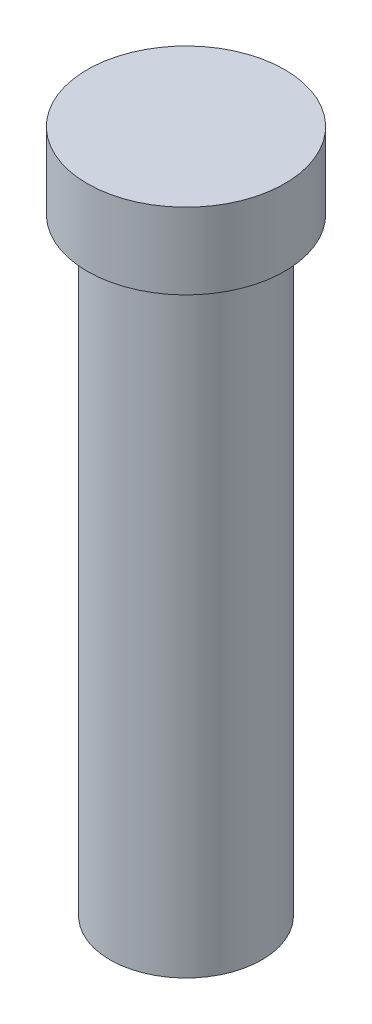
ISO-10303-21;
HEADER;
FILE_DESCRIPTION(('STEP AP214'),'2;1');
FILE_NAME('part.step','',(''),(''),'','','');
FILE_SCHEMA(('AUTOMOTIVE_DESIGN { 1 0 10303 214 1 1 1 1 }'));
ENDSEC;
DATA;
#1=APPLICATION_CONTEXT('core data for automotive mechanical design processes');
#2=APPLICATION_PROTOCOL_DEFINITION('international standard','automotive_design',2000,#1);
#3=PRODUCT_CONTEXT('',#1,'mechanical');
#4=PRODUCT('Part','Part','',(#3));
#5=PRODUCT_RELATED_PRODUCT_CATEGORY('part','',(#4));
#6=PRODUCT_DEFINITION_FORMATION('','',#4);
#7=PRODUCT_DEFINITION_CONTEXT('part definition',#1,'design');
#8=PRODUCT_DEFINITION('design','',#6,#7);
#9=PRODUCT_DEFINITION_SHAPE('','',#8);
#10=(LENGTH_UNIT() NAMED_UNIT(*) SI_UNIT(.MILLI.,.METRE.));
#11=(NAMED_UNIT(*) PLANE_ANGLE_UNIT() SI_UNIT($,.RADIAN.));
#12=(NAMED_UNIT(*) SI_UNIT($,.STERADIAN.) SOLID_ANGLE_UNIT());
#13=UNCERTAINTY_MEASURE_WITH_UNIT(LENGTH_MEASURE(1.E-05),#10,'distance_accuracy_value','');
#14=(GEOMETRIC_REPRESENTATION_CONTEXT(3) GLOBAL_UNCERTAINTY_ASSIGNED_CONTEXT((#13)) GLOBAL_UNIT_ASSIGNED_CONTEXT((#10,
#11,#12)) REPRESENTATION_CONTEXT('',''));
#15=CARTESIAN_POINT('',(0.,0.,0.));
#16=DIRECTION('',(0.,0.,1.));
#17=DIRECTION('',(1.,0.,0.));
#18=AXIS2_PLACEMENT_3D('',#15,#16,#17);
#19=CARTESIAN_POINT('',(0.,0.,0.));
#20=DIRECTION('',(0.,-1.,0.));
#21=DIRECTION('',(0.,0.,-1.));
#22=AXIS2_PLACEMENT_3D('',#19,#20,#21);
#23=PLANE('',#22);
#24=CARTESIAN_POINT('',(0.,0.,0.));
#25=DIRECTION('',(0.,1.,0.));
#26=DIRECTION('',(0.,0.,1.));
#27=AXIS2_PLACEMENT_3D('',#24,#25,#26);
#28=CIRCLE('',#27,6.5);
#29=CARTESIAN_POINT('',(0.,0.,6.5));
#30=VERTEX_POINT('',#29);
#31=EDGE_CURVE('E10',#30,#30,#28,.T.);
#32=ORIENTED_EDGE('',*,*,#31,.T.);
#33=EDGE_LOOP('',(#32));
#34=FACE_BOUND('',#33,.T.);
#35=ADVANCED_FACE('F37',(#34),#23,.F.);
#36=CARTESIAN_POINT('',(0.,8.47697308897347,0.));
#37=DIRECTION('',(0.,1.,0.));
#38=DIRECTION('',(0.,0.,1.));
#39=AXIS2_PLACEMENT_3D('',#36,#37,#38);
#40=CYLINDRICAL_SURFACE('',#39,6.5);
#41=ORIENTED_EDGE('',*,*,#31,.F.);
#42=EDGE_LOOP('',(#41));
#43=FACE_BOUND('',#42,.T.);
#44=CARTESIAN_POINT('',(0.,-5.,0.));
#45=DIRECTION('',(0.,1.,0.));
#46=DIRECTION('',(0.,0.,1.));
#47=AXIS2_PLACEMENT_3D('',#44,#45,#46);
#48=CIRCLE('',#47,6.5);
#49=CARTESIAN_POINT('',(0.,-5.,6.5));
#50=VERTEX_POINT('',#49);
#51=EDGE_CURVE('E43',#50,#50,#48,.T.);
#52=ORIENTED_EDGE('',*,*,#51,.T.);
#53=EDGE_LOOP('',(#52));
#54=FACE_BOUND('',#53,.T.);
#55=ADVANCED_FACE('F69',(#43,#54),#40,.T.);
#56=CARTESIAN_POINT('',(6.5,-5.,0.));
#57=DIRECTION('',(0.,1.,0.));
#58=DIRECTION('',(0.,0.,1.));
#59=AXIS2_PLACEMENT_3D('',#56,#57,#58);
#60=PLANE('',#59);
#61=ORIENTED_EDGE('',*,*,#51,.F.);
#62=EDGE_LOOP('',(#61));
#63=FACE_BOUND('',#62,.T.);
#64=CARTESIAN_POINT('',(0.,-5.,0.));
#65=DIRECTION('',(0.,1.,0.));
#66=DIRECTION('',(0.,0.,1.));
#67=AXIS2_PLACEMENT_3D('',#64,#65,#66);
#68=CIRCLE('',#67,5.);
#69=CARTESIAN_POINT('',(0.,-5.,5.));
#70=VERTEX_POINT('',#69);
#71=EDGE_CURVE('E47',#70,#70,#68,.T.);
#72=ORIENTED_EDGE('',*,*,#71,.T.);
#73=EDGE_LOOP('',(#72));
#74=FACE_BOUND('',#73,.T.);
#75=ADVANCED_FACE('F65',(#63,#74),#60,.F.);
#76=CARTESIAN_POINT('',(0.,8.47697308897347,0.));
#77=DIRECTION('',(0.,1.,0.));
#78=DIRECTION('',(0.,0.,1.));
#79=AXIS2_PLACEMENT_3D('',#76,#77,#78);
#80=CYLINDRICAL_SURFACE('',#79,5.);
#81=ORIENTED_EDGE('',*,*,#71,.F.);
#82=EDGE_LOOP('',(#81));
#83=FACE_BOUND('',#82,.T.);
#84=CARTESIAN_POINT('',(0.,-45.,0.));
#85=DIRECTION('',(0.,1.,0.));
#86=DIRECTION('',(0.,0.,1.));
#87=AXIS2_PLACEMENT_3D('',#84,#85,#86);
#88=CIRCLE('',#87,5.00000000000001);
#89=CARTESIAN_POINT('',(0.,-45.,5.00000000000001));
#90=VERTEX_POINT('',#89);
#91=EDGE_CURVE('E51',#90,#90,#88,.T.);
#92=ORIENTED_EDGE('',*,*,#91,.T.);
#93=EDGE_LOOP('',(#92));
#94=FACE_BOUND('',#93,.T.);
#95=ADVANCED_FACE('F57',(#83,#94),#80,.T.);
#96=CARTESIAN_POINT('',(5.00000000000001,-45.,0.));
#97=DIRECTION('',(0.,1.,0.));
#98=DIRECTION('',(0.,0.,1.));
#99=AXIS2_PLACEMENT_3D('',#96,#97,#98);
#100=PLANE('',#99);
#101=ORIENTED_EDGE('',*,*,#91,.F.);
#102=EDGE_LOOP('',(#101));
#103=FACE_BOUND('',#102,.T.);
#104=ADVANCED_FACE('F59',(#103),#100,.F.);
#105=CLOSED_SHELL('',(#35,#55,#75,#95,#104));
#106=MANIFOLD_SOLID_BREP('B2',#105);
#107=ADVANCED_BREP_SHAPE_REPRESENTATION('',(#18,#106),#14);
#108=SHAPE_DEFINITION_REPRESENTATION(#9,#107);
ENDSEC;
END-ISO-10303-21;
